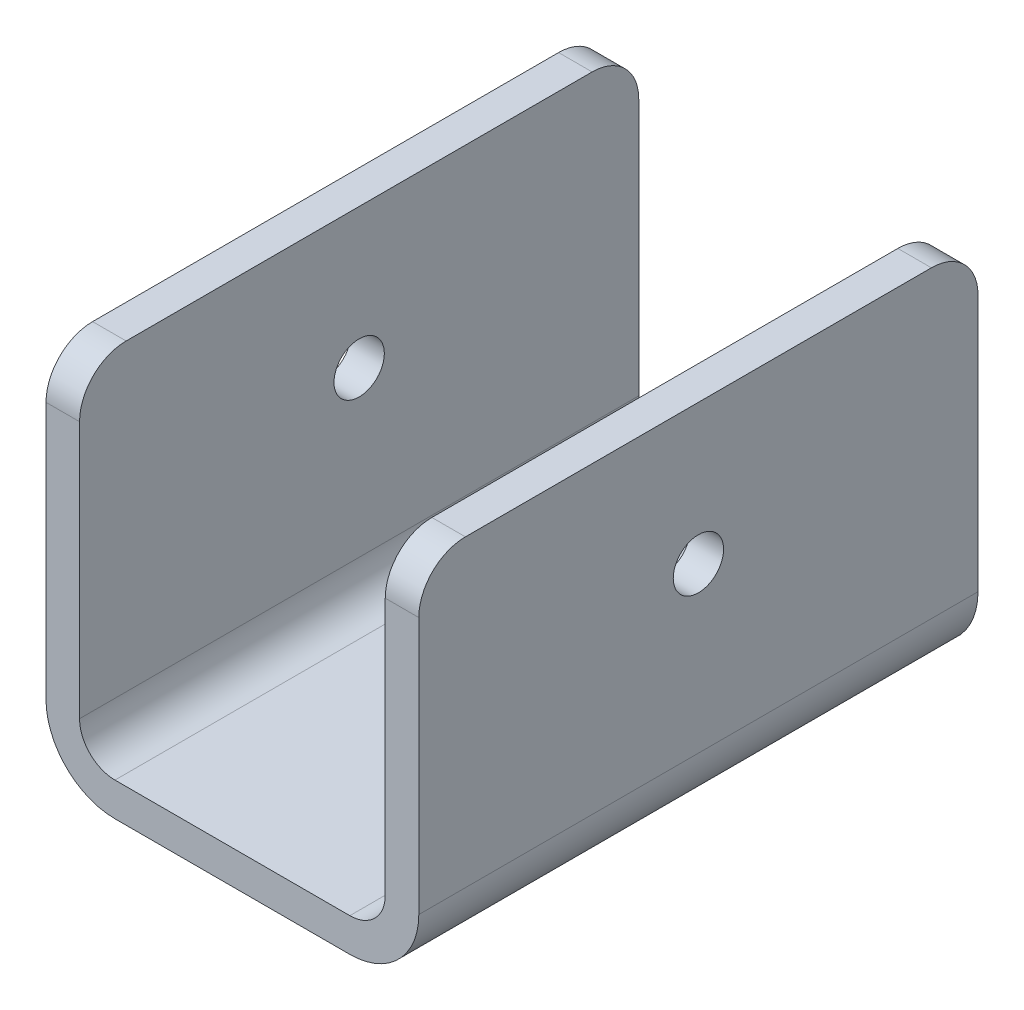
ISO-10303-21;
HEADER;
FILE_DESCRIPTION(('STEP AP214'),'2;1');
FILE_NAME('part.step','',(''),(''),'','','');
FILE_SCHEMA(('AUTOMOTIVE_DESIGN { 1 0 10303 214 1 1 1 1 }'));
ENDSEC;
DATA;
#1=APPLICATION_CONTEXT('core data for automotive mechanical design processes');
#2=APPLICATION_PROTOCOL_DEFINITION('international standard','automotive_design',2000,#1);
#3=PRODUCT_CONTEXT('',#1,'mechanical');
#4=PRODUCT('Part','Part','',(#3));
#5=PRODUCT_RELATED_PRODUCT_CATEGORY('part','',(#4));
#6=PRODUCT_DEFINITION_FORMATION('','',#4);
#7=PRODUCT_DEFINITION_CONTEXT('part definition',#1,'design');
#8=PRODUCT_DEFINITION('design','',#6,#7);
#9=PRODUCT_DEFINITION_SHAPE('','',#8);
#10=(LENGTH_UNIT() NAMED_UNIT(*) SI_UNIT(.MILLI.,.METRE.));
#11=(NAMED_UNIT(*) PLANE_ANGLE_UNIT() SI_UNIT($,.RADIAN.));
#12=(NAMED_UNIT(*) SI_UNIT($,.STERADIAN.) SOLID_ANGLE_UNIT());
#13=UNCERTAINTY_MEASURE_WITH_UNIT(LENGTH_MEASURE(1.E-05),#10,'distance_accuracy_value','');
#14=(GEOMETRIC_REPRESENTATION_CONTEXT(3) GLOBAL_UNCERTAINTY_ASSIGNED_CONTEXT((#13)) GLOBAL_UNIT_ASSIGNED_CONTEXT((#10,
#11,#12)) REPRESENTATION_CONTEXT('',''));
#15=CARTESIAN_POINT('',(0.,0.,0.));
#16=DIRECTION('',(0.,0.,1.));
#17=DIRECTION('',(1.,0.,0.));
#18=AXIS2_PLACEMENT_3D('',#15,#16,#17);
#19=CARTESIAN_POINT('',(-53.9268828906886,31.75,-38.1));
#20=DIRECTION('',(1.,0.,0.));
#21=DIRECTION('',(0.,1.,0.));
#22=AXIS2_PLACEMENT_3D('',#19,#20,#21);
#23=CYLINDRICAL_SURFACE('',#22,3.429);
#24=CARTESIAN_POINT('',(0.,31.75,-38.1));
#25=DIRECTION('',(1.,0.,0.));
#26=DIRECTION('',(0.,1.,0.));
#27=AXIS2_PLACEMENT_3D('',#24,#25,#26);
#28=CIRCLE('',#27,3.429);
#29=CARTESIAN_POINT('',(0.,35.179,-38.1));
#30=VERTEX_POINT('',#29);
#31=EDGE_CURVE('E217',#30,#30,#28,.T.);
#32=ORIENTED_EDGE('',*,*,#31,.F.);
#33=EDGE_LOOP('',(#32));
#34=FACE_BOUND('',#33,.T.);
#35=CARTESIAN_POINT('',(4.572,31.75,-38.1));
#36=DIRECTION('',(-1.,0.,0.));
#37=DIRECTION('',(0.,0.,1.));
#38=AXIS2_PLACEMENT_3D('',#35,#36,#37);
#39=CIRCLE('',#38,3.429);
#40=CARTESIAN_POINT('',(4.572,31.75,-34.671));
#41=VERTEX_POINT('',#40);
#42=EDGE_CURVE('E199',#41,#41,#39,.T.);
#43=ORIENTED_EDGE('',*,*,#42,.F.);
#44=EDGE_LOOP('',(#43));
#45=FACE_BOUND('',#44,.T.);
#46=ADVANCED_FACE('F16',(#34,#45),#23,.F.);
#47=CARTESIAN_POINT('',(-53.9268828906886,31.75,-38.1));
#48=DIRECTION('',(1.,0.,0.));
#49=DIRECTION('',(0.,1.,0.));
#50=AXIS2_PLACEMENT_3D('',#47,#48,#49);
#51=CYLINDRICAL_SURFACE('',#50,3.429);
#52=CARTESIAN_POINT('',(46.228,31.75,-38.1));
#53=DIRECTION('',(1.,0.,0.));
#54=DIRECTION('',(0.,1.,0.));
#55=AXIS2_PLACEMENT_3D('',#52,#53,#54);
#56=CIRCLE('',#55,3.429);
#57=CARTESIAN_POINT('',(46.228,35.179,-38.1));
#58=VERTEX_POINT('',#57);
#59=EDGE_CURVE('E151',#58,#58,#56,.T.);
#60=ORIENTED_EDGE('',*,*,#59,.F.);
#61=EDGE_LOOP('',(#60));
#62=FACE_BOUND('',#61,.T.);
#63=CARTESIAN_POINT('',(50.8,31.75,-38.1));
#64=DIRECTION('',(-1.,0.,0.));
#65=DIRECTION('',(0.,0.,1.));
#66=AXIS2_PLACEMENT_3D('',#63,#64,#65);
#67=CIRCLE('',#66,3.429);
#68=CARTESIAN_POINT('',(50.8,31.75,-34.671));
#69=VERTEX_POINT('',#68);
#70=EDGE_CURVE('E144',#69,#69,#67,.T.);
#71=ORIENTED_EDGE('',*,*,#70,.F.);
#72=EDGE_LOOP('',(#71));
#73=FACE_BOUND('',#72,.T.);
#74=ADVANCED_FACE('F332',(#62,#73),#51,.F.);
#75=CARTESIAN_POINT('',(35.814,44.45,-69.85));
#76=DIRECTION('',(1.,0.,0.));
#77=DIRECTION('',(0.,1.,0.));
#78=AXIS2_PLACEMENT_3D('',#75,#76,#77);
#79=CYLINDRICAL_SURFACE('',#78,6.35);
#80=CARTESIAN_POINT('',(50.8,44.45,-69.85));
#81=DIRECTION('',(-1.,0.,0.));
#82=DIRECTION('',(0.,0.,1.));
#83=AXIS2_PLACEMENT_3D('',#80,#81,#82);
#84=CIRCLE('',#83,6.35);
#85=CARTESIAN_POINT('',(50.8,50.8,-69.85));
#86=VERTEX_POINT('',#85);
#87=CARTESIAN_POINT('',(50.8,44.45,-76.2));
#88=VERTEX_POINT('',#87);
#89=EDGE_CURVE('E10',#86,#88,#84,.T.);
#90=ORIENTED_EDGE('',*,*,#89,.T.);
#91=DIRECTION('',(-1.,0.,0.));
#92=VECTOR('',#91,1.);
#93=CARTESIAN_POINT('',(50.8,44.45,-76.2));
#94=LINE('',#93,#92);
#95=CARTESIAN_POINT('',(46.228,44.45,-76.2));
#96=VERTEX_POINT('',#95);
#97=EDGE_CURVE('E26',#88,#96,#94,.T.);
#98=ORIENTED_EDGE('',*,*,#97,.T.);
#99=CARTESIAN_POINT('',(46.228,44.45,-69.85));
#100=DIRECTION('',(1.,0.,0.));
#101=DIRECTION('',(0.,1.,0.));
#102=AXIS2_PLACEMENT_3D('',#99,#100,#101);
#103=CIRCLE('',#102,6.35);
#104=CARTESIAN_POINT('',(46.228,50.8,-69.85));
#105=VERTEX_POINT('',#104);
#106=EDGE_CURVE('E155',#96,#105,#103,.T.);
#107=ORIENTED_EDGE('',*,*,#106,.T.);
#108=DIRECTION('',(1.,0.,0.));
#109=VECTOR('',#108,1.);
#110=CARTESIAN_POINT('',(46.228,50.8,-69.85));
#111=LINE('',#110,#109);
#112=EDGE_CURVE('E158',#105,#86,#111,.T.);
#113=ORIENTED_EDGE('',*,*,#112,.T.);
#114=EDGE_LOOP('',(#90,#98,#107,#113));
#115=FACE_BOUND('',#114,.T.);
#116=ADVANCED_FACE('F315',(#115),#79,.T.);
#117=CARTESIAN_POINT('',(46.228,50.8,0.));
#118=DIRECTION('',(0.,1.,0.));
#119=DIRECTION('',(0.,0.,1.));
#120=AXIS2_PLACEMENT_3D('',#117,#118,#119);
#121=PLANE('',#120);
#122=ORIENTED_EDGE('',*,*,#112,.F.);
#123=DIRECTION('',(0.,0.,-1.));
#124=VECTOR('',#123,1.);
#125=CARTESIAN_POINT('',(46.228,50.8,-6.35));
#126=LINE('',#125,#124);
#127=CARTESIAN_POINT('',(46.228,50.8,-6.35));
#128=VERTEX_POINT('',#127);
#129=EDGE_CURVE('E162',#128,#105,#126,.T.);
#130=ORIENTED_EDGE('',*,*,#129,.F.);
#131=DIRECTION('',(-1.,0.,0.));
#132=VECTOR('',#131,1.);
#133=CARTESIAN_POINT('',(50.8,50.8,-6.35));
#134=LINE('',#133,#132);
#135=CARTESIAN_POINT('',(50.8,50.8,-6.35));
#136=VERTEX_POINT('',#135);
#137=EDGE_CURVE('E166',#136,#128,#134,.T.);
#138=ORIENTED_EDGE('',*,*,#137,.F.);
#139=DIRECTION('',(0.,0.,-1.));
#140=VECTOR('',#139,1.);
#141=CARTESIAN_POINT('',(50.8,50.8,-6.35));
#142=LINE('',#141,#140);
#143=EDGE_CURVE('E161',#136,#86,#142,.T.);
#144=ORIENTED_EDGE('',*,*,#143,.T.);
#145=EDGE_LOOP('',(#122,#130,#138,#144));
#146=FACE_BOUND('',#145,.T.);
#147=ADVANCED_FACE('F318',(#146),#121,.T.);
#148=CARTESIAN_POINT('',(46.228,9.398,0.));
#149=DIRECTION('',(-1.,0.,0.));
#150=DIRECTION('',(0.,0.,1.));
#151=AXIS2_PLACEMENT_3D('',#148,#149,#150);
#152=PLANE('',#151);
#153=ORIENTED_EDGE('',*,*,#106,.F.);
#154=DIRECTION('',(0.,1.,0.));
#155=VECTOR('',#154,1.);
#156=CARTESIAN_POINT('',(46.228,9.398,-76.2));
#157=LINE('',#156,#155);
#158=CARTESIAN_POINT('',(46.228,9.398,-76.2));
#159=VERTEX_POINT('',#158);
#160=EDGE_CURVE('E172',#159,#96,#157,.T.);
#161=ORIENTED_EDGE('',*,*,#160,.F.);
#162=DIRECTION('',(0.,0.,-1.));
#163=VECTOR('',#162,1.);
#164=CARTESIAN_POINT('',(46.228,9.398,0.));
#165=LINE('',#164,#163);
#166=CARTESIAN_POINT('',(46.228,9.398,0.));
#167=VERTEX_POINT('',#166);
#168=EDGE_CURVE('E175',#167,#159,#165,.T.);
#169=ORIENTED_EDGE('',*,*,#168,.F.);
#170=DIRECTION('',(0.,1.,0.));
#171=VECTOR('',#170,1.);
#172=CARTESIAN_POINT('',(46.228,9.398,0.));
#173=LINE('',#172,#171);
#174=CARTESIAN_POINT('',(46.228,44.45,0.));
#175=VERTEX_POINT('',#174);
#176=EDGE_CURVE('E165',#167,#175,#173,.T.);
#177=ORIENTED_EDGE('',*,*,#176,.T.);
#178=CARTESIAN_POINT('',(46.228,44.45,-6.35));
#179=DIRECTION('',(1.,0.,0.));
#180=DIRECTION('',(0.,1.,0.));
#181=AXIS2_PLACEMENT_3D('',#178,#179,#180);
#182=CIRCLE('',#181,6.35);
#183=EDGE_CURVE('E169',#128,#175,#182,.T.);
#184=ORIENTED_EDGE('',*,*,#183,.F.);
#185=ORIENTED_EDGE('',*,*,#129,.T.);
#186=EDGE_LOOP('',(#153,#161,#169,#177,#184,#185));
#187=FACE_BOUND('',#186,.T.);
#188=ORIENTED_EDGE('',*,*,#59,.T.);
#189=EDGE_LOOP('',(#188));
#190=FACE_BOUND('',#189,.T.);
#191=ADVANCED_FACE('F310',(#187,#190),#152,.T.);
#192=CARTESIAN_POINT('',(12.7,44.45,-69.85));
#193=DIRECTION('',(1.,0.,0.));
#194=DIRECTION('',(0.,1.,0.));
#195=AXIS2_PLACEMENT_3D('',#192,#193,#194);
#196=CYLINDRICAL_SURFACE('',#195,6.35);
#197=CARTESIAN_POINT('',(0.,44.45,-69.85));
#198=DIRECTION('',(1.,0.,0.));
#199=DIRECTION('',(0.,1.,0.));
#200=AXIS2_PLACEMENT_3D('',#197,#198,#199);
#201=CIRCLE('',#200,6.35);
#202=CARTESIAN_POINT('',(0.,44.45,-76.2));
#203=VERTEX_POINT('',#202);
#204=CARTESIAN_POINT('',(0.,50.8,-69.85));
#205=VERTEX_POINT('',#204);
#206=EDGE_CURVE('E184',#203,#205,#201,.T.);
#207=ORIENTED_EDGE('',*,*,#206,.T.);
#208=DIRECTION('',(1.,0.,0.));
#209=VECTOR('',#208,1.);
#210=CARTESIAN_POINT('',(0.,50.8,-69.85));
#211=LINE('',#210,#209);
#212=CARTESIAN_POINT('',(4.572,50.8,-69.85));
#213=VERTEX_POINT('',#212);
#214=EDGE_CURVE('E187',#205,#213,#211,.T.);
#215=ORIENTED_EDGE('',*,*,#214,.T.);
#216=CARTESIAN_POINT('',(4.572,44.45,-69.85));
#217=DIRECTION('',(-1.,0.,0.));
#218=DIRECTION('',(0.,0.,1.));
#219=AXIS2_PLACEMENT_3D('',#216,#217,#218);
#220=CIRCLE('',#219,6.35);
#221=CARTESIAN_POINT('',(4.572,44.45,-76.2));
#222=VERTEX_POINT('',#221);
#223=EDGE_CURVE('E190',#213,#222,#220,.T.);
#224=ORIENTED_EDGE('',*,*,#223,.T.);
#225=DIRECTION('',(-1.,0.,0.));
#226=VECTOR('',#225,1.);
#227=CARTESIAN_POINT('',(4.572,44.45,-76.2));
#228=LINE('',#227,#226);
#229=EDGE_CURVE('E193',#222,#203,#228,.T.);
#230=ORIENTED_EDGE('',*,*,#229,.T.);
#231=EDGE_LOOP('',(#207,#215,#224,#230));
#232=FACE_BOUND('',#231,.T.);
#233=ADVANCED_FACE('F294',(#232),#196,.T.);
#234=CARTESIAN_POINT('',(4.572,50.8,0.));
#235=DIRECTION('',(1.,0.,0.));
#236=DIRECTION('',(0.,0.,-1.));
#237=AXIS2_PLACEMENT_3D('',#234,#235,#236);
#238=PLANE('',#237);
#239=ORIENTED_EDGE('',*,*,#223,.F.);
#240=DIRECTION('',(0.,0.,-1.));
#241=VECTOR('',#240,1.);
#242=CARTESIAN_POINT('',(4.572,50.8,-6.35));
#243=LINE('',#242,#241);
#244=CARTESIAN_POINT('',(4.572,50.8,-6.35));
#245=VERTEX_POINT('',#244);
#246=EDGE_CURVE('E196',#245,#213,#243,.T.);
#247=ORIENTED_EDGE('',*,*,#246,.F.);
#248=CARTESIAN_POINT('',(4.572,44.45,-6.35));
#249=DIRECTION('',(-1.,0.,0.));
#250=DIRECTION('',(0.,0.,1.));
#251=AXIS2_PLACEMENT_3D('',#248,#249,#250);
#252=CIRCLE('',#251,6.35);
#253=CARTESIAN_POINT('',(4.572,44.45,0.));
#254=VERTEX_POINT('',#253);
#255=EDGE_CURVE('E200',#254,#245,#252,.T.);
#256=ORIENTED_EDGE('',*,*,#255,.F.);
#257=DIRECTION('',(0.,-1.,0.));
#258=VECTOR('',#257,1.);
#259=CARTESIAN_POINT('',(4.572,44.45,0.));
#260=LINE('',#259,#258);
#261=CARTESIAN_POINT('',(4.572,9.398,0.));
#262=VERTEX_POINT('',#261);
#263=EDGE_CURVE('E195',#254,#262,#260,.T.);
#264=ORIENTED_EDGE('',*,*,#263,.T.);
#265=DIRECTION('',(0.,0.,-1.));
#266=VECTOR('',#265,1.);
#267=CARTESIAN_POINT('',(4.572,9.398,0.));
#268=LINE('',#267,#266);
#269=CARTESIAN_POINT('',(4.572,9.398,-76.2));
#270=VERTEX_POINT('',#269);
#271=EDGE_CURVE('E206',#262,#270,#268,.T.);
#272=ORIENTED_EDGE('',*,*,#271,.T.);
#273=DIRECTION('',(0.,-1.,0.));
#274=VECTOR('',#273,1.);
#275=CARTESIAN_POINT('',(4.572,44.45,-76.2));
#276=LINE('',#275,#274);
#277=EDGE_CURVE('E209',#222,#270,#276,.T.);
#278=ORIENTED_EDGE('',*,*,#277,.F.);
#279=EDGE_LOOP('',(#239,#247,#256,#264,#272,#278));
#280=FACE_BOUND('',#279,.T.);
#281=ORIENTED_EDGE('',*,*,#42,.T.);
#282=EDGE_LOOP('',(#281));
#283=FACE_BOUND('',#282,.T.);
#284=ADVANCED_FACE('F298',(#280,#283),#238,.T.);
#285=CARTESIAN_POINT('',(0.,50.8,0.));
#286=DIRECTION('',(0.,1.,0.));
#287=DIRECTION('',(0.,0.,1.));
#288=AXIS2_PLACEMENT_3D('',#285,#286,#287);
#289=PLANE('',#288);
#290=ORIENTED_EDGE('',*,*,#214,.F.);
#291=DIRECTION('',(0.,0.,-1.));
#292=VECTOR('',#291,1.);
#293=CARTESIAN_POINT('',(0.,50.8,-6.35));
#294=LINE('',#293,#292);
#295=CARTESIAN_POINT('',(0.,50.8,-6.35));
#296=VERTEX_POINT('',#295);
#297=EDGE_CURVE('E213',#296,#205,#294,.T.);
#298=ORIENTED_EDGE('',*,*,#297,.F.);
#299=DIRECTION('',(-1.,0.,0.));
#300=VECTOR('',#299,1.);
#301=CARTESIAN_POINT('',(4.572,50.8,-6.35));
#302=LINE('',#301,#300);
#303=EDGE_CURVE('E203',#245,#296,#302,.T.);
#304=ORIENTED_EDGE('',*,*,#303,.F.);
#305=ORIENTED_EDGE('',*,*,#246,.T.);
#306=EDGE_LOOP('',(#290,#298,#304,#305));
#307=FACE_BOUND('',#306,.T.);
#308=ADVANCED_FACE('F291',(#307),#289,.T.);
#309=CARTESIAN_POINT('',(35.814,44.45,-6.35));
#310=DIRECTION('',(1.,0.,0.));
#311=DIRECTION('',(0.,1.,0.));
#312=AXIS2_PLACEMENT_3D('',#309,#310,#311);
#313=CYLINDRICAL_SURFACE('',#312,6.35);
#314=CARTESIAN_POINT('',(50.8,44.45,-6.35));
#315=DIRECTION('',(-1.,0.,0.));
#316=DIRECTION('',(0.,0.,1.));
#317=AXIS2_PLACEMENT_3D('',#314,#315,#316);
#318=CIRCLE('',#317,6.35);
#319=CARTESIAN_POINT('',(50.8,44.45,0.));
#320=VERTEX_POINT('',#319);
#321=EDGE_CURVE('E168',#320,#136,#318,.T.);
#322=ORIENTED_EDGE('',*,*,#321,.T.);
#323=ORIENTED_EDGE('',*,*,#137,.T.);
#324=ORIENTED_EDGE('',*,*,#183,.T.);
#325=DIRECTION('',(1.,0.,0.));
#326=VECTOR('',#325,1.);
#327=CARTESIAN_POINT('',(46.228,44.45,0.));
#328=LINE('',#327,#326);
#329=EDGE_CURVE('E183',#175,#320,#328,.T.);
#330=ORIENTED_EDGE('',*,*,#329,.T.);
#331=EDGE_LOOP('',(#322,#323,#324,#330));
#332=FACE_BOUND('',#331,.T.);
#333=ADVANCED_FACE('F320',(#332),#313,.T.);
#334=CARTESIAN_POINT('',(12.7,44.45,-6.35));
#335=DIRECTION('',(1.,0.,0.));
#336=DIRECTION('',(0.,1.,0.));
#337=AXIS2_PLACEMENT_3D('',#334,#335,#336);
#338=CYLINDRICAL_SURFACE('',#337,6.35);
#339=CARTESIAN_POINT('',(0.,44.45,-6.35));
#340=DIRECTION('',(1.,0.,0.));
#341=DIRECTION('',(0.,1.,0.));
#342=AXIS2_PLACEMENT_3D('',#339,#340,#341);
#343=CIRCLE('',#342,6.35);
#344=CARTESIAN_POINT('',(0.,44.45,0.));
#345=VERTEX_POINT('',#344);
#346=EDGE_CURVE('E223',#296,#345,#343,.T.);
#347=ORIENTED_EDGE('',*,*,#346,.T.);
#348=DIRECTION('',(1.,0.,0.));
#349=VECTOR('',#348,1.);
#350=CARTESIAN_POINT('',(0.,44.45,0.));
#351=LINE('',#350,#349);
#352=EDGE_CURVE('E202',#345,#254,#351,.T.);
#353=ORIENTED_EDGE('',*,*,#352,.T.);
#354=ORIENTED_EDGE('',*,*,#255,.T.);
#355=ORIENTED_EDGE('',*,*,#303,.T.);
#356=EDGE_LOOP('',(#347,#353,#354,#355));
#357=FACE_BOUND('',#356,.T.);
#358=ADVANCED_FACE('F288',(#357),#338,.T.);
#359=CARTESIAN_POINT('',(41.402,9.398,0.));
#360=DIRECTION('',(0.,0.,-1.));
#361=DIRECTION('',(0.,-1.,0.));
#362=AXIS2_PLACEMENT_3D('',#359,#360,#361);
#363=CYLINDRICAL_SURFACE('',#362,4.826);
#364=CARTESIAN_POINT('',(41.402,9.398,0.));
#365=DIRECTION('',(0.,0.,1.));
#366=DIRECTION('',(1.,0.,0.));
#367=AXIS2_PLACEMENT_3D('',#364,#365,#366);
#368=CIRCLE('',#367,4.826);
#369=CARTESIAN_POINT('',(41.402,4.572,0.));
#370=VERTEX_POINT('',#369);
#371=EDGE_CURVE('E178',#370,#167,#368,.T.);
#372=ORIENTED_EDGE('',*,*,#371,.T.);
#373=ORIENTED_EDGE('',*,*,#168,.T.);
#374=CARTESIAN_POINT('',(41.402,9.398,-76.2));
#375=DIRECTION('',(0.,0.,1.));
#376=DIRECTION('',(1.,0.,0.));
#377=AXIS2_PLACEMENT_3D('',#374,#375,#376);
#378=CIRCLE('',#377,4.826);
#379=CARTESIAN_POINT('',(41.402,4.572,-76.2));
#380=VERTEX_POINT('',#379);
#381=EDGE_CURVE('E174',#380,#159,#378,.T.);
#382=ORIENTED_EDGE('',*,*,#381,.F.);
#383=DIRECTION('',(0.,0.,-1.));
#384=VECTOR('',#383,1.);
#385=CARTESIAN_POINT('',(41.402,4.572,0.));
#386=LINE('',#385,#384);
#387=EDGE_CURVE('E233',#370,#380,#386,.T.);
#388=ORIENTED_EDGE('',*,*,#387,.F.);
#389=EDGE_LOOP('',(#372,#373,#382,#388));
#390=FACE_BOUND('',#389,.T.);
#391=ADVANCED_FACE('F308',(#390),#363,.F.);
#392=CARTESIAN_POINT('',(9.398,4.572,0.));
#393=DIRECTION('',(0.,1.,0.));
#394=DIRECTION('',(0.,0.,1.));
#395=AXIS2_PLACEMENT_3D('',#392,#393,#394);
#396=PLANE('',#395);
#397=DIRECTION('',(1.,0.,0.));
#398=VECTOR('',#397,1.);
#399=CARTESIAN_POINT('',(9.398,4.572,0.));
#400=LINE('',#399,#398);
#401=CARTESIAN_POINT('',(9.398,4.572,0.));
#402=VERTEX_POINT('',#401);
#403=EDGE_CURVE('E179',#402,#370,#400,.T.);
#404=ORIENTED_EDGE('',*,*,#403,.T.);
#405=ORIENTED_EDGE('',*,*,#387,.T.);
#406=DIRECTION('',(1.,0.,0.));
#407=VECTOR('',#406,1.);
#408=CARTESIAN_POINT('',(9.398,4.572,-76.2));
#409=LINE('',#408,#407);
#410=CARTESIAN_POINT('',(9.398,4.572,-76.2));
#411=VERTEX_POINT('',#410);
#412=EDGE_CURVE('E232',#411,#380,#409,.T.);
#413=ORIENTED_EDGE('',*,*,#412,.F.);
#414=DIRECTION('',(0.,0.,-1.));
#415=VECTOR('',#414,1.);
#416=CARTESIAN_POINT('',(9.398,4.572,0.));
#417=LINE('',#416,#415);
#418=EDGE_CURVE('E241',#402,#411,#417,.T.);
#419=ORIENTED_EDGE('',*,*,#418,.F.);
#420=EDGE_LOOP('',(#404,#405,#413,#419));
#421=FACE_BOUND('',#420,.T.);
#422=ADVANCED_FACE('F304',(#421),#396,.T.);
#423=CARTESIAN_POINT('',(9.398,9.398,0.));
#424=DIRECTION('',(0.,0.,-1.));
#425=DIRECTION('',(0.,-1.,0.));
#426=AXIS2_PLACEMENT_3D('',#423,#424,#425);
#427=CYLINDRICAL_SURFACE('',#426,4.826);
#428=CARTESIAN_POINT('',(9.398,9.398,0.));
#429=DIRECTION('',(0.,0.,1.));
#430=DIRECTION('',(1.,0.,0.));
#431=AXIS2_PLACEMENT_3D('',#428,#429,#430);
#432=CIRCLE('',#431,4.826);
#433=EDGE_CURVE('E236',#262,#402,#432,.T.);
#434=ORIENTED_EDGE('',*,*,#433,.T.);
#435=ORIENTED_EDGE('',*,*,#418,.T.);
#436=CARTESIAN_POINT('',(9.398,9.398,-76.2));
#437=DIRECTION('',(0.,0.,1.));
#438=DIRECTION('',(1.,0.,0.));
#439=AXIS2_PLACEMENT_3D('',#436,#437,#438);
#440=CIRCLE('',#439,4.826);
#441=EDGE_CURVE('E212',#270,#411,#440,.T.);
#442=ORIENTED_EDGE('',*,*,#441,.F.);
#443=ORIENTED_EDGE('',*,*,#271,.F.);
#444=EDGE_LOOP('',(#434,#435,#442,#443));
#445=FACE_BOUND('',#444,.T.);
#446=ADVANCED_FACE('F301',(#445),#427,.F.);
#447=CARTESIAN_POINT('',(0.,9.398,0.));
#448=DIRECTION('',(-1.,0.,0.));
#449=DIRECTION('',(0.,0.,1.));
#450=AXIS2_PLACEMENT_3D('',#447,#448,#449);
#451=PLANE('',#450);
#452=ORIENTED_EDGE('',*,*,#206,.F.);
#453=DIRECTION('',(0.,1.,0.));
#454=VECTOR('',#453,1.);
#455=CARTESIAN_POINT('',(0.,9.398,-76.2));
#456=LINE('',#455,#454);
#457=CARTESIAN_POINT('',(0.,9.398,-76.2));
#458=VERTEX_POINT('',#457);
#459=EDGE_CURVE('E211',#458,#203,#456,.T.);
#460=ORIENTED_EDGE('',*,*,#459,.F.);
#461=DIRECTION('',(0.,0.,-1.));
#462=VECTOR('',#461,1.);
#463=CARTESIAN_POINT('',(0.,9.398,0.));
#464=LINE('',#463,#462);
#465=CARTESIAN_POINT('',(0.,9.398,0.));
#466=VERTEX_POINT('',#465);
#467=EDGE_CURVE('E251',#466,#458,#464,.T.);
#468=ORIENTED_EDGE('',*,*,#467,.F.);
#469=DIRECTION('',(0.,1.,0.));
#470=VECTOR('',#469,1.);
#471=CARTESIAN_POINT('',(0.,9.398,0.));
#472=LINE('',#471,#470);
#473=EDGE_CURVE('E216',#466,#345,#472,.T.);
#474=ORIENTED_EDGE('',*,*,#473,.T.);
#475=ORIENTED_EDGE('',*,*,#346,.F.);
#476=ORIENTED_EDGE('',*,*,#297,.T.);
#477=EDGE_LOOP('',(#452,#460,#468,#474,#475,#476));
#478=FACE_BOUND('',#477,.T.);
#479=ORIENTED_EDGE('',*,*,#31,.T.);
#480=EDGE_LOOP('',(#479));
#481=FACE_BOUND('',#480,.T.);
#482=ADVANCED_FACE('F282',(#478,#481),#451,.T.);
#483=CARTESIAN_POINT('',(9.398,9.398,0.));
#484=DIRECTION('',(0.,0.,-1.));
#485=DIRECTION('',(0.,-1.,0.));
#486=AXIS2_PLACEMENT_3D('',#483,#484,#485);
#487=CYLINDRICAL_SURFACE('',#486,9.398);
#488=CARTESIAN_POINT('',(9.398,9.398,0.));
#489=DIRECTION('',(0.,0.,-1.));
#490=DIRECTION('',(0.,-1.,0.));
#491=AXIS2_PLACEMENT_3D('',#488,#489,#490);
#492=CIRCLE('',#491,9.398);
#493=CARTESIAN_POINT('',(9.398,0.,0.));
#494=VERTEX_POINT('',#493);
#495=EDGE_CURVE('E254',#494,#466,#492,.T.);
#496=ORIENTED_EDGE('',*,*,#495,.T.);
#497=ORIENTED_EDGE('',*,*,#467,.T.);
#498=CARTESIAN_POINT('',(9.398,9.398,-76.2));
#499=DIRECTION('',(0.,0.,-1.));
#500=DIRECTION('',(0.,-1.,0.));
#501=AXIS2_PLACEMENT_3D('',#498,#499,#500);
#502=CIRCLE('',#501,9.398);
#503=CARTESIAN_POINT('',(9.398,0.,-76.2));
#504=VERTEX_POINT('',#503);
#505=EDGE_CURVE('E250',#504,#458,#502,.T.);
#506=ORIENTED_EDGE('',*,*,#505,.F.);
#507=DIRECTION('',(0.,0.,-1.));
#508=VECTOR('',#507,1.);
#509=CARTESIAN_POINT('',(9.398,0.,0.));
#510=LINE('',#509,#508);
#511=EDGE_CURVE('E262',#494,#504,#510,.T.);
#512=ORIENTED_EDGE('',*,*,#511,.F.);
#513=EDGE_LOOP('',(#496,#497,#506,#512));
#514=FACE_BOUND('',#513,.T.);
#515=ADVANCED_FACE('F279',(#514),#487,.T.);
#516=CARTESIAN_POINT('',(41.402,0.,0.));
#517=DIRECTION('',(0.,-1.,0.));
#518=DIRECTION('',(0.,0.,-1.));
#519=AXIS2_PLACEMENT_3D('',#516,#517,#518);
#520=PLANE('',#519);
#521=DIRECTION('',(-1.,0.,0.));
#522=VECTOR('',#521,1.);
#523=CARTESIAN_POINT('',(41.402,0.,0.));
#524=LINE('',#523,#522);
#525=CARTESIAN_POINT('',(41.402,0.,0.));
#526=VERTEX_POINT('',#525);
#527=EDGE_CURVE('E255',#526,#494,#524,.T.);
#528=ORIENTED_EDGE('',*,*,#527,.T.);
#529=ORIENTED_EDGE('',*,*,#511,.T.);
#530=DIRECTION('',(-1.,0.,0.));
#531=VECTOR('',#530,1.);
#532=CARTESIAN_POINT('',(41.402,0.,-76.2));
#533=LINE('',#532,#531);
#534=CARTESIAN_POINT('',(41.402,0.,-76.2));
#535=VERTEX_POINT('',#534);
#536=EDGE_CURVE('E133',#535,#504,#533,.T.);
#537=ORIENTED_EDGE('',*,*,#536,.F.);
#538=DIRECTION('',(0.,0.,-1.));
#539=VECTOR('',#538,1.);
#540=CARTESIAN_POINT('',(41.402,0.,0.));
#541=LINE('',#540,#539);
#542=EDGE_CURVE('E131',#526,#535,#541,.T.);
#543=ORIENTED_EDGE('',*,*,#542,.F.);
#544=EDGE_LOOP('',(#528,#529,#537,#543));
#545=FACE_BOUND('',#544,.T.);
#546=ADVANCED_FACE('F277',(#545),#520,.T.);
#547=CARTESIAN_POINT('',(41.402,9.398,0.));
#548=DIRECTION('',(0.,0.,-1.));
#549=DIRECTION('',(0.,-1.,0.));
#550=AXIS2_PLACEMENT_3D('',#547,#548,#549);
#551=CYLINDRICAL_SURFACE('',#550,9.398);
#552=CARTESIAN_POINT('',(41.402,9.398,0.));
#553=DIRECTION('',(0.,0.,-1.));
#554=DIRECTION('',(0.,-1.,0.));
#555=AXIS2_PLACEMENT_3D('',#552,#553,#554);
#556=CIRCLE('',#555,9.398);
#557=CARTESIAN_POINT('',(50.8,9.398,0.));
#558=VERTEX_POINT('',#557);
#559=EDGE_CURVE('E265',#558,#526,#556,.T.);
#560=ORIENTED_EDGE('',*,*,#559,.T.);
#561=ORIENTED_EDGE('',*,*,#542,.T.);
#562=CARTESIAN_POINT('',(41.402,9.398,-76.2));
#563=DIRECTION('',(0.,0.,-1.));
#564=DIRECTION('',(0.,-1.,0.));
#565=AXIS2_PLACEMENT_3D('',#562,#563,#564);
#566=CIRCLE('',#565,9.398);
#567=CARTESIAN_POINT('',(50.8,9.398,-76.2));
#568=VERTEX_POINT('',#567);
#569=EDGE_CURVE('E130',#568,#535,#566,.T.);
#570=ORIENTED_EDGE('',*,*,#569,.F.);
#571=DIRECTION('',(0.,0.,-1.));
#572=VECTOR('',#571,1.);
#573=CARTESIAN_POINT('',(50.8,9.398,0.));
#574=LINE('',#573,#572);
#575=EDGE_CURVE('E126',#558,#568,#574,.T.);
#576=ORIENTED_EDGE('',*,*,#575,.F.);
#577=EDGE_LOOP('',(#560,#561,#570,#576));
#578=FACE_BOUND('',#577,.T.);
#579=ADVANCED_FACE('F18',(#578),#551,.T.);
#580=CARTESIAN_POINT('',(50.8,50.8,0.));
#581=DIRECTION('',(1.,0.,0.));
#582=DIRECTION('',(0.,0.,-1.));
#583=AXIS2_PLACEMENT_3D('',#580,#581,#582);
#584=PLANE('',#583);
#585=ORIENTED_EDGE('',*,*,#89,.F.);
#586=ORIENTED_EDGE('',*,*,#143,.F.);
#587=ORIENTED_EDGE('',*,*,#321,.F.);
#588=DIRECTION('',(0.,-1.,0.));
#589=VECTOR('',#588,1.);
#590=CARTESIAN_POINT('',(50.8,44.45,0.));
#591=LINE('',#590,#589);
#592=EDGE_CURVE('E143',#320,#558,#591,.T.);
#593=ORIENTED_EDGE('',*,*,#592,.T.);
#594=ORIENTED_EDGE('',*,*,#575,.T.);
#595=DIRECTION('',(0.,-1.,0.));
#596=VECTOR('',#595,1.);
#597=CARTESIAN_POINT('',(50.8,44.45,-76.2));
#598=LINE('',#597,#596);
#599=EDGE_CURVE('E20',#88,#568,#598,.T.);
#600=ORIENTED_EDGE('',*,*,#599,.F.);
#601=EDGE_LOOP('',(#585,#586,#587,#593,#594,#600));
#602=FACE_BOUND('',#601,.T.);
#603=ORIENTED_EDGE('',*,*,#70,.T.);
#604=EDGE_LOOP('',(#603));
#605=FACE_BOUND('',#604,.T.);
#606=ADVANCED_FACE('F139',(#602,#605),#584,.T.);
#607=CARTESIAN_POINT('',(25.4,21.0927674921387,-76.2));
#608=DIRECTION('',(0.,0.,1.));
#609=DIRECTION('',(1.,0.,0.));
#610=AXIS2_PLACEMENT_3D('',#607,#608,#609);
#611=PLANE('',#610);
#612=ORIENTED_EDGE('',*,*,#97,.F.);
#613=ORIENTED_EDGE('',*,*,#599,.T.);
#614=ORIENTED_EDGE('',*,*,#569,.T.);
#615=ORIENTED_EDGE('',*,*,#536,.T.);
#616=ORIENTED_EDGE('',*,*,#505,.T.);
#617=ORIENTED_EDGE('',*,*,#459,.T.);
#618=ORIENTED_EDGE('',*,*,#229,.F.);
#619=ORIENTED_EDGE('',*,*,#277,.T.);
#620=ORIENTED_EDGE('',*,*,#441,.T.);
#621=ORIENTED_EDGE('',*,*,#412,.T.);
#622=ORIENTED_EDGE('',*,*,#381,.T.);
#623=ORIENTED_EDGE('',*,*,#160,.T.);
#624=EDGE_LOOP('',(#612,#613,#614,#615,#616,#617,#618,#619,#620,#621,#622,#623));
#625=FACE_BOUND('',#624,.T.);
#626=ADVANCED_FACE('F146',(#625),#611,.F.);
#627=CARTESIAN_POINT('',(25.4,21.0927674921387,0.));
#628=DIRECTION('',(0.,0.,1.));
#629=DIRECTION('',(1.,0.,0.));
#630=AXIS2_PLACEMENT_3D('',#627,#628,#629);
#631=PLANE('',#630);
#632=ORIENTED_EDGE('',*,*,#329,.F.);
#633=ORIENTED_EDGE('',*,*,#176,.F.);
#634=ORIENTED_EDGE('',*,*,#371,.F.);
#635=ORIENTED_EDGE('',*,*,#403,.F.);
#636=ORIENTED_EDGE('',*,*,#433,.F.);
#637=ORIENTED_EDGE('',*,*,#263,.F.);
#638=ORIENTED_EDGE('',*,*,#352,.F.);
#639=ORIENTED_EDGE('',*,*,#473,.F.);
#640=ORIENTED_EDGE('',*,*,#495,.F.);
#641=ORIENTED_EDGE('',*,*,#527,.F.);
#642=ORIENTED_EDGE('',*,*,#559,.F.);
#643=ORIENTED_EDGE('',*,*,#592,.F.);
#644=EDGE_LOOP('',(#632,#633,#634,#635,#636,#637,#638,#639,#640,#641,#642,#643));
#645=FACE_BOUND('',#644,.T.);
#646=ADVANCED_FACE('F273',(#645),#631,.T.);
#647=CLOSED_SHELL('',(#46,#74,#116,#147,#191,#233,#284,#308,#333,#358,#391,#422,#446,#482,#515,
#546,#579,#606,#626,#646));
#648=MANIFOLD_SOLID_BREP('B1',#647);
#649=ADVANCED_BREP_SHAPE_REPRESENTATION('',(#18,#648),#14);
#650=SHAPE_DEFINITION_REPRESENTATION(#9,#649);
ENDSEC;
END-ISO-10303-21;
